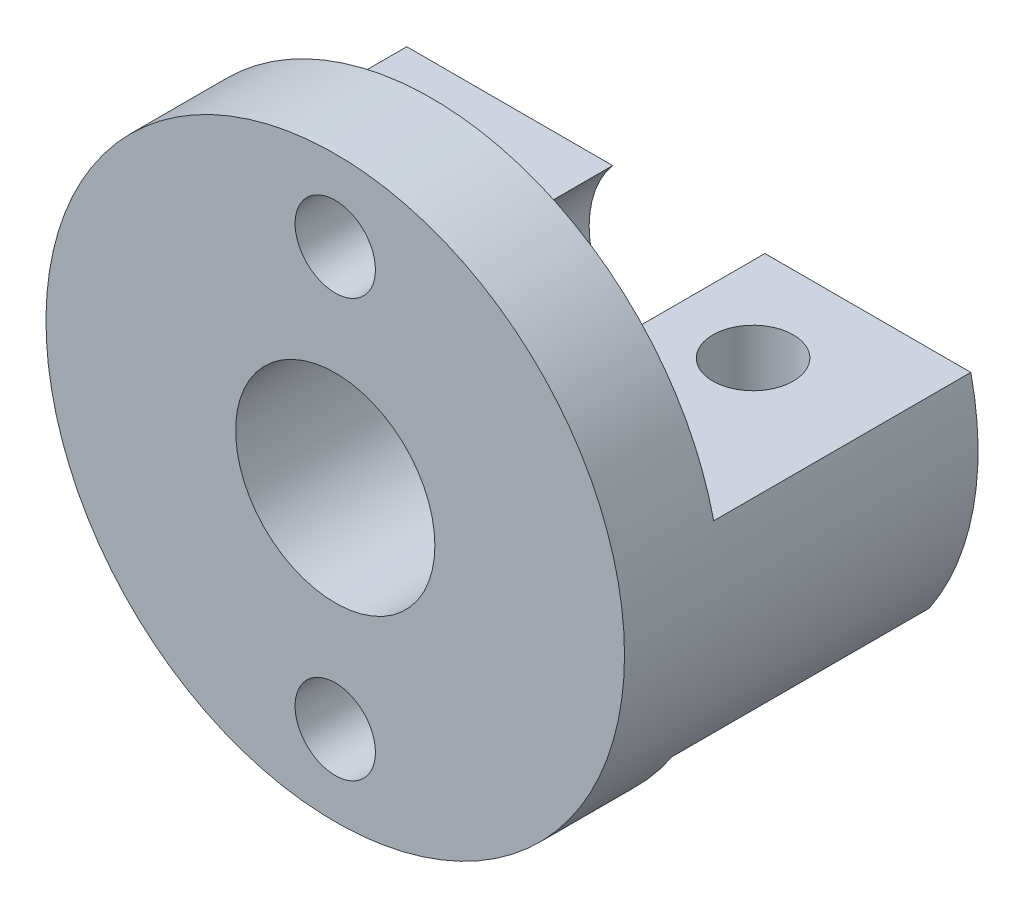
ISO-10303-21;
HEADER;
FILE_DESCRIPTION(('STEP AP214'),'2;1');
FILE_NAME('part.step','',(''),(''),'','','');
FILE_SCHEMA(('AUTOMOTIVE_DESIGN { 1 0 10303 214 1 1 1 1 }'));
ENDSEC;
DATA;
#1=APPLICATION_CONTEXT('core data for automotive mechanical design processes');
#2=APPLICATION_PROTOCOL_DEFINITION('international standard','automotive_design',2000,#1);
#3=PRODUCT_CONTEXT('',#1,'mechanical');
#4=PRODUCT('Part','Part','',(#3));
#5=PRODUCT_RELATED_PRODUCT_CATEGORY('part','',(#4));
#6=PRODUCT_DEFINITION_FORMATION('','',#4);
#7=PRODUCT_DEFINITION_CONTEXT('part definition',#1,'design');
#8=PRODUCT_DEFINITION('design','',#6,#7);
#9=PRODUCT_DEFINITION_SHAPE('','',#8);
#10=(LENGTH_UNIT() NAMED_UNIT(*) SI_UNIT(.MILLI.,.METRE.));
#11=(NAMED_UNIT(*) PLANE_ANGLE_UNIT() SI_UNIT($,.RADIAN.));
#12=(NAMED_UNIT(*) SI_UNIT($,.STERADIAN.) SOLID_ANGLE_UNIT());
#13=UNCERTAINTY_MEASURE_WITH_UNIT(LENGTH_MEASURE(1.E-05),#10,'distance_accuracy_value','');
#14=(GEOMETRIC_REPRESENTATION_CONTEXT(3) GLOBAL_UNCERTAINTY_ASSIGNED_CONTEXT((#13)) GLOBAL_UNIT_ASSIGNED_CONTEXT((#10,
#11,#12)) REPRESENTATION_CONTEXT('',''));
#15=CARTESIAN_POINT('',(0.,0.,0.));
#16=DIRECTION('',(0.,0.,1.));
#17=DIRECTION('',(1.,0.,0.));
#18=AXIS2_PLACEMENT_3D('',#15,#16,#17);
#19=CARTESIAN_POINT('',(0.,0.,-3.));
#20=DIRECTION('',(0.,0.,-1.));
#21=DIRECTION('',(1.,0.,0.));
#22=AXIS2_PLACEMENT_3D('',#19,#20,#21);
#23=PLANE('',#22);
#24=CARTESIAN_POINT('',(0.,6.5,-3.));
#25=DIRECTION('',(0.,0.,1.));
#26=DIRECTION('',(1.,0.,0.));
#27=AXIS2_PLACEMENT_3D('',#24,#25,#26);
#28=CIRCLE('',#27,1.24999999999999);
#29=CARTESIAN_POINT('',(1.24999999999999,6.5,-3.));
#30=VERTEX_POINT('',#29);
#31=EDGE_CURVE('E214',#30,#30,#28,.T.);
#32=ORIENTED_EDGE('',*,*,#31,.T.);
#33=EDGE_LOOP('',(#32));
#34=FACE_BOUND('',#33,.T.);
#35=DIRECTION('',(1.,0.,0.));
#36=VECTOR('',#35,1.);
#37=CARTESIAN_POINT('',(-8.77496438739212,2.,-3.));
#38=LINE('',#37,#36);
#39=CARTESIAN_POINT('',(2.3685438564654,2.,-3.));
#40=VERTEX_POINT('',#39);
#41=CARTESIAN_POINT('',(8.77496438739212,2.,-3.));
#42=VERTEX_POINT('',#41);
#43=EDGE_CURVE('E125',#40,#42,#38,.T.);
#44=ORIENTED_EDGE('',*,*,#43,.F.);
#45=CARTESIAN_POINT('',(0.,0.,-3.));
#46=DIRECTION('',(0.,0.,1.));
#47=DIRECTION('',(1.,0.,0.));
#48=AXIS2_PLACEMENT_3D('',#45,#46,#47);
#49=CIRCLE('',#48,3.1);
#50=CARTESIAN_POINT('',(-2.3685438564654,2.,-3.));
#51=VERTEX_POINT('',#50);
#52=EDGE_CURVE('E124',#40,#51,#49,.T.);
#53=ORIENTED_EDGE('',*,*,#52,.T.);
#54=CARTESIAN_POINT('',(-8.77496438739212,2.,-3.));
#55=VERTEX_POINT('',#54);
#56=EDGE_CURVE('E105',#55,#51,#38,.T.);
#57=ORIENTED_EDGE('',*,*,#56,.F.);
#58=CARTESIAN_POINT('',(0.,0.,-3.));
#59=DIRECTION('',(0.,0.,1.));
#60=DIRECTION('',(1.,0.,0.));
#61=AXIS2_PLACEMENT_3D('',#58,#59,#60);
#62=CIRCLE('',#61,9.);
#63=EDGE_CURVE('E114',#42,#55,#62,.T.);
#64=ORIENTED_EDGE('',*,*,#63,.F.);
#65=EDGE_LOOP('',(#44,#53,#57,#64));
#66=FACE_BOUND('',#65,.T.);
#67=ADVANCED_FACE('F47',(#34,#66),#23,.T.);
#68=CARTESIAN_POINT('',(0.,-6.5,-3.));
#69=DIRECTION('',(0.,0.,1.));
#70=DIRECTION('',(1.,0.,0.));
#71=AXIS2_PLACEMENT_3D('',#68,#69,#70);
#72=CIRCLE('',#71,1.24999999999999);
#73=CARTESIAN_POINT('',(1.24999999999999,-6.5,-3.));
#74=VERTEX_POINT('',#73);
#75=EDGE_CURVE('E216',#74,#74,#72,.T.);
#76=ORIENTED_EDGE('',*,*,#75,.T.);
#77=EDGE_LOOP('',(#76));
#78=FACE_BOUND('',#77,.T.);
#79=DIRECTION('',(-1.,0.,0.));
#80=VECTOR('',#79,1.);
#81=CARTESIAN_POINT('',(-7.48331477354788,-5.,-3.));
#82=LINE('',#81,#80);
#83=CARTESIAN_POINT('',(7.48331477354788,-5.,-3.));
#84=VERTEX_POINT('',#83);
#85=CARTESIAN_POINT('',(-7.48331477354788,-5.,-3.));
#86=VERTEX_POINT('',#85);
#87=EDGE_CURVE('E127',#84,#86,#82,.T.);
#88=ORIENTED_EDGE('',*,*,#87,.F.);
#89=EDGE_CURVE('E122',#86,#84,#62,.T.);
#90=ORIENTED_EDGE('',*,*,#89,.F.);
#91=EDGE_LOOP('',(#88,#90));
#92=FACE_BOUND('',#91,.T.);
#93=ADVANCED_FACE('F163',(#78,#92),#23,.T.);
#94=CARTESIAN_POINT('',(0.,0.,0.));
#95=DIRECTION('',(0.,0.,-1.));
#96=DIRECTION('',(1.,0.,0.));
#97=AXIS2_PLACEMENT_3D('',#94,#95,#96);
#98=PLANE('',#97);
#99=CARTESIAN_POINT('',(0.,6.5,0.));
#100=DIRECTION('',(0.,0.,1.));
#101=DIRECTION('',(1.,0.,0.));
#102=AXIS2_PLACEMENT_3D('',#99,#100,#101);
#103=CIRCLE('',#102,1.25);
#104=CARTESIAN_POINT('',(1.25,6.5,0.));
#105=VERTEX_POINT('',#104);
#106=EDGE_CURVE('E212',#105,#105,#103,.T.);
#107=ORIENTED_EDGE('',*,*,#106,.F.);
#108=EDGE_LOOP('',(#107));
#109=FACE_BOUND('',#108,.T.);
#110=CARTESIAN_POINT('',(0.,-6.5,0.));
#111=DIRECTION('',(0.,0.,1.));
#112=DIRECTION('',(1.,0.,0.));
#113=AXIS2_PLACEMENT_3D('',#110,#111,#112);
#114=CIRCLE('',#113,1.25);
#115=CARTESIAN_POINT('',(1.25,-6.5,0.));
#116=VERTEX_POINT('',#115);
#117=EDGE_CURVE('E221',#116,#116,#114,.T.);
#118=ORIENTED_EDGE('',*,*,#117,.F.);
#119=EDGE_LOOP('',(#118));
#120=FACE_BOUND('',#119,.T.);
#121=CARTESIAN_POINT('',(0.,0.,0.));
#122=DIRECTION('',(0.,0.,1.));
#123=DIRECTION('',(1.,0.,0.));
#124=AXIS2_PLACEMENT_3D('',#121,#122,#123);
#125=CIRCLE('',#124,3.1);
#126=CARTESIAN_POINT('',(3.1,0.,0.));
#127=VERTEX_POINT('',#126);
#128=EDGE_CURVE('E130',#127,#127,#125,.T.);
#129=ORIENTED_EDGE('',*,*,#128,.F.);
#130=EDGE_LOOP('',(#129));
#131=FACE_BOUND('',#130,.T.);
#132=CARTESIAN_POINT('',(0.,0.,0.));
#133=DIRECTION('',(0.,0.,1.));
#134=DIRECTION('',(1.,0.,0.));
#135=AXIS2_PLACEMENT_3D('',#132,#133,#134);
#136=CIRCLE('',#135,9.);
#137=CARTESIAN_POINT('',(9.,0.,0.));
#138=VERTEX_POINT('',#137);
#139=EDGE_CURVE('E121',#138,#138,#136,.T.);
#140=ORIENTED_EDGE('',*,*,#139,.T.);
#141=EDGE_LOOP('',(#140));
#142=FACE_BOUND('',#141,.T.);
#143=ADVANCED_FACE('F49',(#109,#120,#131,#142),#98,.F.);
#144=CARTESIAN_POINT('',(-8.77496438739212,2.,-3.));
#145=DIRECTION('',(0.,-1.,0.));
#146=DIRECTION('',(0.,0.,1.));
#147=AXIS2_PLACEMENT_3D('',#144,#145,#146);
#148=PLANE('',#147);
#149=CARTESIAN_POINT('',(5.,2.,-8.));
#150=DIRECTION('',(0.,-1.,0.));
#151=DIRECTION('',(0.,0.,-1.));
#152=AXIS2_PLACEMENT_3D('',#149,#150,#151);
#153=CIRCLE('',#152,1.24999999999999);
#154=CARTESIAN_POINT('',(5.,2.,-9.24999999999999));
#155=VERTEX_POINT('',#154);
#156=EDGE_CURVE('E229',#155,#155,#153,.T.);
#157=ORIENTED_EDGE('',*,*,#156,.T.);
#158=EDGE_LOOP('',(#157));
#159=FACE_BOUND('',#158,.T.);
#160=DIRECTION('',(-1.,0.,0.));
#161=VECTOR('',#160,1.);
#162=CARTESIAN_POINT('',(-8.77496438739212,2.,-11.));
#163=LINE('',#162,#161);
#164=CARTESIAN_POINT('',(8.77496438739212,2.,-11.));
#165=VERTEX_POINT('',#164);
#166=CARTESIAN_POINT('',(2.3685438564654,2.,-11.));
#167=VERTEX_POINT('',#166);
#168=EDGE_CURVE('E152',#165,#167,#163,.T.);
#169=ORIENTED_EDGE('',*,*,#168,.T.);
#170=DIRECTION('',(0.,0.,-1.));
#171=VECTOR('',#170,1.);
#172=CARTESIAN_POINT('',(2.3685438564654,2.,4.));
#173=LINE('',#172,#171);
#174=EDGE_CURVE('E56',#40,#167,#173,.T.);
#175=ORIENTED_EDGE('',*,*,#174,.F.);
#176=ORIENTED_EDGE('',*,*,#43,.T.);
#177=DIRECTION('',(0.,0.,-1.));
#178=VECTOR('',#177,1.);
#179=CARTESIAN_POINT('',(8.77496438739212,2.,-3.));
#180=LINE('',#179,#178);
#181=EDGE_CURVE('E111',#42,#165,#180,.T.);
#182=ORIENTED_EDGE('',*,*,#181,.T.);
#183=EDGE_LOOP('',(#169,#175,#176,#182));
#184=FACE_BOUND('',#183,.T.);
#185=ADVANCED_FACE('F162',(#159,#184),#148,.F.);
#186=CARTESIAN_POINT('',(0.,0.,-16.));
#187=DIRECTION('',(0.,0.,1.));
#188=DIRECTION('',(-1.,0.,0.));
#189=AXIS2_PLACEMENT_3D('',#186,#187,#188);
#190=CYLINDRICAL_SURFACE('',#189,9.);
#191=CARTESIAN_POINT('',(0.,0.,-11.));
#192=DIRECTION('',(0.,0.,1.));
#193=DIRECTION('',(1.,0.,0.));
#194=AXIS2_PLACEMENT_3D('',#191,#192,#193);
#195=CIRCLE('',#194,9.);
#196=CARTESIAN_POINT('',(7.48331477354788,-5.,-11.));
#197=VERTEX_POINT('',#196);
#198=EDGE_CURVE('E143',#197,#165,#195,.T.);
#199=ORIENTED_EDGE('',*,*,#198,.T.);
#200=ORIENTED_EDGE('',*,*,#181,.F.);
#201=ORIENTED_EDGE('',*,*,#63,.T.);
#202=DIRECTION('',(0.,0.,-1.));
#203=VECTOR('',#202,1.);
#204=CARTESIAN_POINT('',(-8.77496438739212,2.,-3.));
#205=LINE('',#204,#203);
#206=CARTESIAN_POINT('',(-8.77496438739212,2.,-11.));
#207=VERTEX_POINT('',#206);
#208=EDGE_CURVE('E101',#55,#207,#205,.T.);
#209=ORIENTED_EDGE('',*,*,#208,.T.);
#210=CARTESIAN_POINT('',(-7.48331477354788,-5.,-11.));
#211=VERTEX_POINT('',#210);
#212=EDGE_CURVE('E146',#207,#211,#195,.T.);
#213=ORIENTED_EDGE('',*,*,#212,.T.);
#214=DIRECTION('',(0.,0.,-1.));
#215=VECTOR('',#214,1.);
#216=CARTESIAN_POINT('',(-7.48331477354788,-5.,-3.));
#217=LINE('',#216,#215);
#218=EDGE_CURVE('E136',#86,#211,#217,.T.);
#219=ORIENTED_EDGE('',*,*,#218,.F.);
#220=ORIENTED_EDGE('',*,*,#89,.T.);
#221=DIRECTION('',(0.,0.,-1.));
#222=VECTOR('',#221,1.);
#223=CARTESIAN_POINT('',(7.48331477354788,-5.,-3.));
#224=LINE('',#223,#222);
#225=EDGE_CURVE('E133',#84,#197,#224,.T.);
#226=ORIENTED_EDGE('',*,*,#225,.T.);
#227=EDGE_LOOP('',(#199,#200,#201,#209,#213,#219,#220,#226));
#228=FACE_BOUND('',#227,.T.);
#229=ORIENTED_EDGE('',*,*,#139,.F.);
#230=EDGE_LOOP('',(#229));
#231=FACE_BOUND('',#230,.T.);
#232=ADVANCED_FACE('F115',(#228,#231),#190,.T.);
#233=CARTESIAN_POINT('',(-7.48331477354788,-5.,-3.));
#234=DIRECTION('',(0.,1.,0.));
#235=DIRECTION('',(0.,0.,-1.));
#236=AXIS2_PLACEMENT_3D('',#233,#234,#235);
#237=PLANE('',#236);
#238=CARTESIAN_POINT('',(-5.,-5.,-8.));
#239=DIRECTION('',(0.,-1.,0.));
#240=DIRECTION('',(0.,0.,-1.));
#241=AXIS2_PLACEMENT_3D('',#238,#239,#240);
#242=CIRCLE('',#241,1.24999999999999);
#243=CARTESIAN_POINT('',(-5.,-5.,-9.24999999999999));
#244=VERTEX_POINT('',#243);
#245=EDGE_CURVE('E227',#244,#244,#242,.T.);
#246=ORIENTED_EDGE('',*,*,#245,.F.);
#247=EDGE_LOOP('',(#246));
#248=FACE_BOUND('',#247,.T.);
#249=CARTESIAN_POINT('',(5.,-5.,-8.));
#250=DIRECTION('',(0.,-1.,0.));
#251=DIRECTION('',(0.,0.,-1.));
#252=AXIS2_PLACEMENT_3D('',#249,#250,#251);
#253=CIRCLE('',#252,1.24999999999999);
#254=CARTESIAN_POINT('',(5.,-5.,-9.24999999999999));
#255=VERTEX_POINT('',#254);
#256=EDGE_CURVE('E51',#255,#255,#253,.T.);
#257=ORIENTED_EDGE('',*,*,#256,.F.);
#258=EDGE_LOOP('',(#257));
#259=FACE_BOUND('',#258,.T.);
#260=DIRECTION('',(1.,0.,0.));
#261=VECTOR('',#260,1.);
#262=CARTESIAN_POINT('',(-7.48331477354788,-5.,-11.));
#263=LINE('',#262,#261);
#264=EDGE_CURVE('E155',#211,#197,#263,.T.);
#265=ORIENTED_EDGE('',*,*,#264,.T.);
#266=ORIENTED_EDGE('',*,*,#225,.F.);
#267=ORIENTED_EDGE('',*,*,#87,.T.);
#268=ORIENTED_EDGE('',*,*,#218,.T.);
#269=EDGE_LOOP('',(#265,#266,#267,#268));
#270=FACE_BOUND('',#269,.T.);
#271=ADVANCED_FACE('F186',(#248,#259,#270),#237,.F.);
#272=CARTESIAN_POINT('',(-5.,2.,-8.));
#273=DIRECTION('',(0.,-1.,0.));
#274=DIRECTION('',(0.,0.,-1.));
#275=AXIS2_PLACEMENT_3D('',#272,#273,#274);
#276=CIRCLE('',#275,1.24999999999999);
#277=CARTESIAN_POINT('',(-5.,2.,-9.24999999999999));
#278=VERTEX_POINT('',#277);
#279=EDGE_CURVE('E224',#278,#278,#276,.T.);
#280=ORIENTED_EDGE('',*,*,#279,.T.);
#281=EDGE_LOOP('',(#280));
#282=FACE_BOUND('',#281,.T.);
#283=DIRECTION('',(-1.,0.,0.));
#284=VECTOR('',#283,1.);
#285=CARTESIAN_POINT('',(-8.77496438739212,2.,-11.));
#286=LINE('',#285,#284);
#287=CARTESIAN_POINT('',(-2.3685438564654,2.,-11.));
#288=VERTEX_POINT('',#287);
#289=EDGE_CURVE('E107',#288,#207,#286,.T.);
#290=ORIENTED_EDGE('',*,*,#289,.T.);
#291=ORIENTED_EDGE('',*,*,#208,.F.);
#292=ORIENTED_EDGE('',*,*,#56,.T.);
#293=DIRECTION('',(0.,0.,-1.));
#294=VECTOR('',#293,1.);
#295=CARTESIAN_POINT('',(-2.3685438564654,2.,4.));
#296=LINE('',#295,#294);
#297=EDGE_CURVE('E69',#288,#51,#296,.F.);
#298=ORIENTED_EDGE('',*,*,#297,.F.);
#299=EDGE_LOOP('',(#290,#291,#292,#298));
#300=FACE_BOUND('',#299,.T.);
#301=ADVANCED_FACE('F103',(#282,#300),#148,.F.);
#302=CARTESIAN_POINT('',(0.,0.,4.));
#303=DIRECTION('',(0.,0.,-1.));
#304=DIRECTION('',(1.,0.,0.));
#305=AXIS2_PLACEMENT_3D('',#302,#303,#304);
#306=CYLINDRICAL_SURFACE('',#305,3.1);
#307=ORIENTED_EDGE('',*,*,#128,.T.);
#308=EDGE_LOOP('',(#307));
#309=FACE_BOUND('',#308,.T.);
#310=CARTESIAN_POINT('',(0.,0.,-11.));
#311=DIRECTION('',(0.,0.,1.));
#312=DIRECTION('',(1.,0.,0.));
#313=AXIS2_PLACEMENT_3D('',#310,#311,#312);
#314=CIRCLE('',#313,3.1);
#315=EDGE_CURVE('E11',#167,#288,#314,.F.);
#316=ORIENTED_EDGE('',*,*,#315,.T.);
#317=ORIENTED_EDGE('',*,*,#297,.T.);
#318=ORIENTED_EDGE('',*,*,#52,.F.);
#319=ORIENTED_EDGE('',*,*,#174,.T.);
#320=EDGE_LOOP('',(#316,#317,#318,#319));
#321=FACE_BOUND('',#320,.T.);
#322=ADVANCED_FACE('F159',(#309,#321),#306,.F.);
#323=CARTESIAN_POINT('',(0.,0.,-11.));
#324=DIRECTION('',(0.,0.,-1.));
#325=DIRECTION('',(1.,0.,0.));
#326=AXIS2_PLACEMENT_3D('',#323,#324,#325);
#327=PLANE('',#326);
#328=ORIENTED_EDGE('',*,*,#264,.F.);
#329=ORIENTED_EDGE('',*,*,#212,.F.);
#330=ORIENTED_EDGE('',*,*,#289,.F.);
#331=ORIENTED_EDGE('',*,*,#315,.F.);
#332=ORIENTED_EDGE('',*,*,#168,.F.);
#333=ORIENTED_EDGE('',*,*,#198,.F.);
#334=EDGE_LOOP('',(#328,#329,#330,#331,#332,#333));
#335=FACE_BOUND('',#334,.T.);
#336=ADVANCED_FACE('F192',(#335),#327,.T.);
#337=CARTESIAN_POINT('',(5.,2.,-8.));
#338=DIRECTION('',(0.,1.,0.));
#339=DIRECTION('',(0.,0.,-1.));
#340=AXIS2_PLACEMENT_3D('',#337,#338,#339);
#341=CYLINDRICAL_SURFACE('',#340,1.24999999999999);
#342=ORIENTED_EDGE('',*,*,#156,.F.);
#343=EDGE_LOOP('',(#342));
#344=FACE_BOUND('',#343,.T.);
#345=ORIENTED_EDGE('',*,*,#256,.T.);
#346=EDGE_LOOP('',(#345));
#347=FACE_BOUND('',#346,.T.);
#348=ADVANCED_FACE('F195',(#344,#347),#341,.F.);
#349=CARTESIAN_POINT('',(-5.,2.,-8.));
#350=DIRECTION('',(0.,1.,0.));
#351=DIRECTION('',(0.,0.,-1.));
#352=AXIS2_PLACEMENT_3D('',#349,#350,#351);
#353=CYLINDRICAL_SURFACE('',#352,1.24999999999999);
#354=ORIENTED_EDGE('',*,*,#279,.F.);
#355=EDGE_LOOP('',(#354));
#356=FACE_BOUND('',#355,.T.);
#357=ORIENTED_EDGE('',*,*,#245,.T.);
#358=EDGE_LOOP('',(#357));
#359=FACE_BOUND('',#358,.T.);
#360=ADVANCED_FACE('F198',(#356,#359),#353,.F.);
#361=CARTESIAN_POINT('',(0.,-6.5,-3.));
#362=DIRECTION('',(0.,0.,-1.));
#363=DIRECTION('',(1.,0.,0.));
#364=AXIS2_PLACEMENT_3D('',#361,#362,#363);
#365=CYLINDRICAL_SURFACE('',#364,1.24999999999999);
#366=ORIENTED_EDGE('',*,*,#117,.T.);
#367=EDGE_LOOP('',(#366));
#368=FACE_BOUND('',#367,.T.);
#369=ORIENTED_EDGE('',*,*,#75,.F.);
#370=EDGE_LOOP('',(#369));
#371=FACE_BOUND('',#370,.T.);
#372=ADVANCED_FACE('F201',(#368,#371),#365,.F.);
#373=CARTESIAN_POINT('',(0.,6.5,-3.));
#374=DIRECTION('',(0.,0.,-1.));
#375=DIRECTION('',(1.,0.,0.));
#376=AXIS2_PLACEMENT_3D('',#373,#374,#375);
#377=CYLINDRICAL_SURFACE('',#376,1.24999999999999);
#378=ORIENTED_EDGE('',*,*,#106,.T.);
#379=EDGE_LOOP('',(#378));
#380=FACE_BOUND('',#379,.T.);
#381=ORIENTED_EDGE('',*,*,#31,.F.);
#382=EDGE_LOOP('',(#381));
#383=FACE_BOUND('',#382,.T.);
#384=ADVANCED_FACE('F205',(#380,#383),#377,.F.);
#385=CLOSED_SHELL('',(#67,#93,#143,#185,#232,#271,#301,#322,#336,#348,#360,#372,#384));
#386=MANIFOLD_SOLID_BREP('B2',#385);
#387=ADVANCED_BREP_SHAPE_REPRESENTATION('',(#18,#386),#14);
#388=SHAPE_DEFINITION_REPRESENTATION(#9,#387);
ENDSEC;
END-ISO-10303-21;
